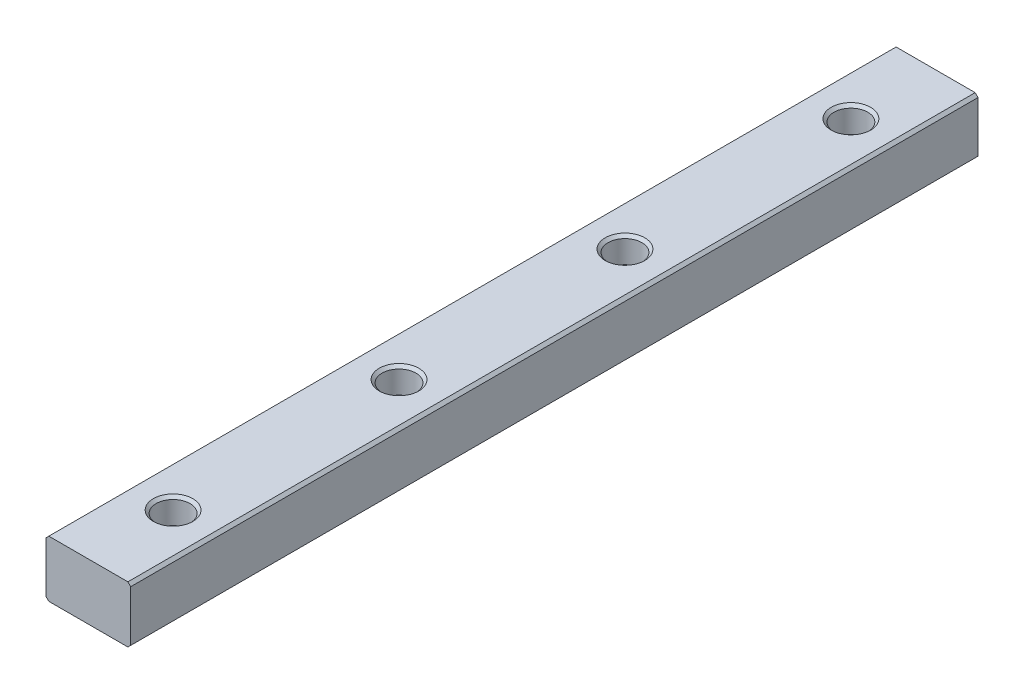
ISO-10303-21;
HEADER;
FILE_DESCRIPTION(('STEP AP214'),'2;1');
FILE_NAME('part.step','',(''),(''),'','','');
FILE_SCHEMA(('AUTOMOTIVE_DESIGN { 1 0 10303 214 1 1 1 1 }'));
ENDSEC;
DATA;
#1=APPLICATION_CONTEXT('core data for automotive mechanical design processes');
#2=APPLICATION_PROTOCOL_DEFINITION('international standard','automotive_design',2000,#1);
#3=PRODUCT_CONTEXT('',#1,'mechanical');
#4=PRODUCT('Part','Part','',(#3));
#5=PRODUCT_RELATED_PRODUCT_CATEGORY('part','',(#4));
#6=PRODUCT_DEFINITION_FORMATION('','',#4);
#7=PRODUCT_DEFINITION_CONTEXT('part definition',#1,'design');
#8=PRODUCT_DEFINITION('design','',#6,#7);
#9=PRODUCT_DEFINITION_SHAPE('','',#8);
#10=(LENGTH_UNIT() NAMED_UNIT(*) SI_UNIT(.MILLI.,.METRE.));
#11=(NAMED_UNIT(*) PLANE_ANGLE_UNIT() SI_UNIT($,.RADIAN.));
#12=(NAMED_UNIT(*) SI_UNIT($,.STERADIAN.) SOLID_ANGLE_UNIT());
#13=UNCERTAINTY_MEASURE_WITH_UNIT(LENGTH_MEASURE(1.E-05),#10,'distance_accuracy_value','');
#14=(GEOMETRIC_REPRESENTATION_CONTEXT(3) GLOBAL_UNCERTAINTY_ASSIGNED_CONTEXT((#13)) GLOBAL_UNIT_ASSIGNED_CONTEXT((#10,
#11,#12)) REPRESENTATION_CONTEXT('',''));
#15=CARTESIAN_POINT('',(0.,0.,0.));
#16=DIRECTION('',(0.,0.,1.));
#17=DIRECTION('',(1.,0.,0.));
#18=AXIS2_PLACEMENT_3D('',#15,#16,#17);
#19=CARTESIAN_POINT('',(7.5,-5.,75.));
#20=DIRECTION('',(0.,1.,0.));
#21=DIRECTION('',(0.,0.,1.));
#22=AXIS2_PLACEMENT_3D('',#19,#20,#21);
#23=PLANE('',#22);
#24=DIRECTION('',(1.,0.,0.));
#25=VECTOR('',#24,1.);
#26=CARTESIAN_POINT('',(7.5,-5.,75.));
#27=LINE('',#26,#25);
#28=CARTESIAN_POINT('',(-7.00000000000002,-5.,75.));
#29=VERTEX_POINT('',#28);
#30=CARTESIAN_POINT('',(7.,-5.,75.));
#31=VERTEX_POINT('',#30);
#32=EDGE_CURVE('E121',#29,#31,#27,.T.);
#33=ORIENTED_EDGE('',*,*,#32,.F.);
#34=DIRECTION('',(0.,0.,-1.));
#35=VECTOR('',#34,1.);
#36=CARTESIAN_POINT('',(-7.00000000000002,-5.,75.));
#37=LINE('',#36,#35);
#38=CARTESIAN_POINT('',(-7.00000000000002,-5.,-75.));
#39=VERTEX_POINT('',#38);
#40=EDGE_CURVE('E105',#29,#39,#37,.T.);
#41=ORIENTED_EDGE('',*,*,#40,.T.);
#42=DIRECTION('',(1.,0.,0.));
#43=VECTOR('',#42,1.);
#44=CARTESIAN_POINT('',(7.5,-5.,-75.));
#45=LINE('',#44,#43);
#46=CARTESIAN_POINT('',(6.99999999999999,-5.,-75.));
#47=VERTEX_POINT('',#46);
#48=EDGE_CURVE('E118',#39,#47,#45,.T.);
#49=ORIENTED_EDGE('',*,*,#48,.T.);
#50=DIRECTION('',(0.,0.,1.));
#51=VECTOR('',#50,1.);
#52=CARTESIAN_POINT('',(6.99999999999999,-5.,75.));
#53=LINE('',#52,#51);
#54=EDGE_CURVE('E123',#47,#31,#53,.T.);
#55=ORIENTED_EDGE('',*,*,#54,.T.);
#56=EDGE_LOOP('',(#33,#41,#49,#55));
#57=FACE_BOUND('',#56,.T.);
#58=CARTESIAN_POINT('',(0.,-5.,60.0000000000001));
#59=DIRECTION('',(0.,1.,0.));
#60=DIRECTION('',(0.,0.,1.));
#61=AXIS2_PLACEMENT_3D('',#58,#59,#60);
#62=CIRCLE('',#61,2.25);
#63=CARTESIAN_POINT('',(0.,-5.,62.2500000000001));
#64=VERTEX_POINT('',#63);
#65=EDGE_CURVE('E139',#64,#64,#62,.T.);
#66=ORIENTED_EDGE('',*,*,#65,.T.);
#67=EDGE_LOOP('',(#66));
#68=FACE_BOUND('',#67,.T.);
#69=CARTESIAN_POINT('',(0.,-5.,20.0000000000001));
#70=DIRECTION('',(0.,1.,0.));
#71=DIRECTION('',(0.,0.,1.));
#72=AXIS2_PLACEMENT_3D('',#69,#70,#71);
#73=CIRCLE('',#72,2.25);
#74=CARTESIAN_POINT('',(0.,-5.,22.2500000000001));
#75=VERTEX_POINT('',#74);
#76=EDGE_CURVE('E247',#75,#75,#73,.T.);
#77=ORIENTED_EDGE('',*,*,#76,.T.);
#78=EDGE_LOOP('',(#77));
#79=FACE_BOUND('',#78,.T.);
#80=CARTESIAN_POINT('',(0.,-5.,-19.9999999999999));
#81=DIRECTION('',(0.,1.,0.));
#82=DIRECTION('',(0.,0.,1.));
#83=AXIS2_PLACEMENT_3D('',#80,#81,#82);
#84=CIRCLE('',#83,2.25);
#85=CARTESIAN_POINT('',(0.,-5.,-17.7499999999999));
#86=VERTEX_POINT('',#85);
#87=EDGE_CURVE('E152',#86,#86,#84,.T.);
#88=ORIENTED_EDGE('',*,*,#87,.T.);
#89=EDGE_LOOP('',(#88));
#90=FACE_BOUND('',#89,.T.);
#91=CARTESIAN_POINT('',(0.,-5.,-59.9999999999999));
#92=DIRECTION('',(0.,1.,0.));
#93=DIRECTION('',(0.,0.,1.));
#94=AXIS2_PLACEMENT_3D('',#91,#92,#93);
#95=CIRCLE('',#94,2.25);
#96=CARTESIAN_POINT('',(0.,-5.,-57.7499999999999));
#97=VERTEX_POINT('',#96);
#98=EDGE_CURVE('E170',#97,#97,#95,.T.);
#99=ORIENTED_EDGE('',*,*,#98,.T.);
#100=EDGE_LOOP('',(#99));
#101=FACE_BOUND('',#100,.T.);
#102=ADVANCED_FACE('F35',(#57,#68,#79,#90,#101),#23,.F.);
#103=CARTESIAN_POINT('',(7.5,5.00000000000001,75.));
#104=DIRECTION('',(0.,-1.,0.));
#105=DIRECTION('',(1.,0.,0.));
#106=AXIS2_PLACEMENT_3D('',#103,#104,#105);
#107=PLANE('',#106);
#108=DIRECTION('',(-1.,0.,0.));
#109=VECTOR('',#108,1.);
#110=CARTESIAN_POINT('',(7.5,5.00000000000001,75.));
#111=LINE('',#110,#109);
#112=CARTESIAN_POINT('',(6.99999999999998,5.00000000000001,75.));
#113=VERTEX_POINT('',#112);
#114=CARTESIAN_POINT('',(-7.,5.00000000000001,75.));
#115=VERTEX_POINT('',#114);
#116=EDGE_CURVE('E143',#113,#115,#111,.T.);
#117=ORIENTED_EDGE('',*,*,#116,.F.);
#118=DIRECTION('',(0.,0.,-1.));
#119=VECTOR('',#118,1.);
#120=CARTESIAN_POINT('',(6.99999999999998,5.00000000000001,75.));
#121=LINE('',#120,#119);
#122=CARTESIAN_POINT('',(6.99999999999998,5.00000000000001,-75.));
#123=VERTEX_POINT('',#122);
#124=EDGE_CURVE('E11',#113,#123,#121,.T.);
#125=ORIENTED_EDGE('',*,*,#124,.T.);
#126=DIRECTION('',(-1.,0.,0.));
#127=VECTOR('',#126,1.);
#128=CARTESIAN_POINT('',(7.5,5.00000000000001,-75.));
#129=LINE('',#128,#127);
#130=CARTESIAN_POINT('',(-7.,5.,-75.));
#131=VERTEX_POINT('',#130);
#132=EDGE_CURVE('E131',#123,#131,#129,.T.);
#133=ORIENTED_EDGE('',*,*,#132,.T.);
#134=DIRECTION('',(0.,0.,1.));
#135=VECTOR('',#134,1.);
#136=CARTESIAN_POINT('',(-7.,5.,75.));
#137=LINE('',#136,#135);
#138=EDGE_CURVE('E43',#131,#115,#137,.T.);
#139=ORIENTED_EDGE('',*,*,#138,.T.);
#140=EDGE_LOOP('',(#117,#125,#133,#139));
#141=FACE_BOUND('',#140,.T.);
#142=CARTESIAN_POINT('',(0.,5.00000000000001,60.0000000000001));
#143=DIRECTION('',(0.,-1.,0.));
#144=DIRECTION('',(1.,0.,0.));
#145=AXIS2_PLACEMENT_3D('',#142,#143,#144);
#146=CIRCLE('',#145,3.50000000000002);
#147=CARTESIAN_POINT('',(3.50000000000002,5.00000000000001,60.0000000000001));
#148=VERTEX_POINT('',#147);
#149=EDGE_CURVE('E149',#148,#148,#146,.T.);
#150=ORIENTED_EDGE('',*,*,#149,.T.);
#151=EDGE_LOOP('',(#150));
#152=FACE_BOUND('',#151,.T.);
#153=CARTESIAN_POINT('',(0.,5.00000000000001,20.0000000000001));
#154=DIRECTION('',(0.,-1.,0.));
#155=DIRECTION('',(1.,0.,0.));
#156=AXIS2_PLACEMENT_3D('',#153,#154,#155);
#157=CIRCLE('',#156,3.50000000000002);
#158=CARTESIAN_POINT('',(3.50000000000002,5.00000000000001,20.0000000000001));
#159=VERTEX_POINT('',#158);
#160=EDGE_CURVE('E244',#159,#159,#157,.T.);
#161=ORIENTED_EDGE('',*,*,#160,.T.);
#162=EDGE_LOOP('',(#161));
#163=FACE_BOUND('',#162,.T.);
#164=CARTESIAN_POINT('',(0.,5.00000000000001,-19.9999999999999));
#165=DIRECTION('',(0.,-1.,0.));
#166=DIRECTION('',(1.,0.,0.));
#167=AXIS2_PLACEMENT_3D('',#164,#165,#166);
#168=CIRCLE('',#167,3.50000000000002);
#169=CARTESIAN_POINT('',(3.50000000000002,5.00000000000001,-19.9999999999999));
#170=VERTEX_POINT('',#169);
#171=EDGE_CURVE('E155',#170,#170,#168,.T.);
#172=ORIENTED_EDGE('',*,*,#171,.T.);
#173=EDGE_LOOP('',(#172));
#174=FACE_BOUND('',#173,.T.);
#175=CARTESIAN_POINT('',(0.,5.00000000000001,-59.9999999999999));
#176=DIRECTION('',(0.,-1.,0.));
#177=DIRECTION('',(1.,0.,0.));
#178=AXIS2_PLACEMENT_3D('',#175,#176,#177);
#179=CIRCLE('',#178,3.50000000000002);
#180=CARTESIAN_POINT('',(3.50000000000002,5.00000000000001,-59.9999999999999));
#181=VERTEX_POINT('',#180);
#182=EDGE_CURVE('E173',#181,#181,#179,.T.);
#183=ORIENTED_EDGE('',*,*,#182,.T.);
#184=EDGE_LOOP('',(#183));
#185=FACE_BOUND('',#184,.T.);
#186=ADVANCED_FACE('F219',(#141,#152,#163,#174,#185),#107,.F.);
#187=CARTESIAN_POINT('',(-7.5,-5.,75.));
#188=DIRECTION('',(1.,0.,0.));
#189=DIRECTION('',(0.,0.,-1.));
#190=AXIS2_PLACEMENT_3D('',#187,#188,#189);
#191=PLANE('',#190);
#192=DIRECTION('',(0.,-1.,0.));
#193=VECTOR('',#192,1.);
#194=CARTESIAN_POINT('',(-7.5,-5.,-75.));
#195=LINE('',#194,#193);
#196=CARTESIAN_POINT('',(-7.50000000000001,4.50000000000002,-75.));
#197=VERTEX_POINT('',#196);
#198=CARTESIAN_POINT('',(-7.5,-4.5,-75.));
#199=VERTEX_POINT('',#198);
#200=EDGE_CURVE('E128',#197,#199,#195,.T.);
#201=ORIENTED_EDGE('',*,*,#200,.T.);
#202=DIRECTION('',(0.,0.,1.));
#203=VECTOR('',#202,1.);
#204=CARTESIAN_POINT('',(-7.5,-4.5,75.));
#205=LINE('',#204,#203);
#206=CARTESIAN_POINT('',(-7.5,-4.5,75.));
#207=VERTEX_POINT('',#206);
#208=EDGE_CURVE('E106',#199,#207,#205,.T.);
#209=ORIENTED_EDGE('',*,*,#208,.T.);
#210=DIRECTION('',(0.,-1.,0.));
#211=VECTOR('',#210,1.);
#212=CARTESIAN_POINT('',(-7.5,-5.,75.));
#213=LINE('',#212,#211);
#214=CARTESIAN_POINT('',(-7.50000000000001,4.50000000000002,75.));
#215=VERTEX_POINT('',#214);
#216=EDGE_CURVE('E138',#215,#207,#213,.T.);
#217=ORIENTED_EDGE('',*,*,#216,.F.);
#218=DIRECTION('',(0.,0.,-1.));
#219=VECTOR('',#218,1.);
#220=CARTESIAN_POINT('',(-7.5,4.50000000000002,75.));
#221=LINE('',#220,#219);
#222=EDGE_CURVE('E111',#215,#197,#221,.T.);
#223=ORIENTED_EDGE('',*,*,#222,.T.);
#224=EDGE_LOOP('',(#201,#209,#217,#223));
#225=FACE_BOUND('',#224,.T.);
#226=ADVANCED_FACE('F275',(#225),#191,.F.);
#227=CARTESIAN_POINT('',(7.5,-5.,75.));
#228=DIRECTION('',(-1.,0.,0.));
#229=DIRECTION('',(0.,0.,1.));
#230=AXIS2_PLACEMENT_3D('',#227,#228,#229);
#231=PLANE('',#230);
#232=DIRECTION('',(0.,1.,0.));
#233=VECTOR('',#232,1.);
#234=CARTESIAN_POINT('',(7.5,-5.,75.));
#235=LINE('',#234,#233);
#236=CARTESIAN_POINT('',(7.5,-4.50000000000001,75.));
#237=VERTEX_POINT('',#236);
#238=CARTESIAN_POINT('',(7.5,4.49999999999999,75.));
#239=VERTEX_POINT('',#238);
#240=EDGE_CURVE('E212',#237,#239,#235,.T.);
#241=ORIENTED_EDGE('',*,*,#240,.F.);
#242=DIRECTION('',(0.,0.,-1.));
#243=VECTOR('',#242,1.);
#244=CARTESIAN_POINT('',(7.5,-4.50000000000001,75.));
#245=LINE('',#244,#243);
#246=CARTESIAN_POINT('',(7.5,-4.50000000000001,-75.));
#247=VERTEX_POINT('',#246);
#248=EDGE_CURVE('E205',#237,#247,#245,.T.);
#249=ORIENTED_EDGE('',*,*,#248,.T.);
#250=DIRECTION('',(0.,1.,0.));
#251=VECTOR('',#250,1.);
#252=CARTESIAN_POINT('',(7.5,-5.,-75.));
#253=LINE('',#252,#251);
#254=CARTESIAN_POINT('',(7.5,4.49999999999999,-75.));
#255=VERTEX_POINT('',#254);
#256=EDGE_CURVE('E127',#247,#255,#253,.T.);
#257=ORIENTED_EDGE('',*,*,#256,.T.);
#258=DIRECTION('',(0.,0.,1.));
#259=VECTOR('',#258,1.);
#260=CARTESIAN_POINT('',(7.5,4.49999999999999,75.));
#261=LINE('',#260,#259);
#262=EDGE_CURVE('E203',#255,#239,#261,.T.);
#263=ORIENTED_EDGE('',*,*,#262,.T.);
#264=EDGE_LOOP('',(#241,#249,#257,#263));
#265=FACE_BOUND('',#264,.T.);
#266=ADVANCED_FACE('F210',(#265),#231,.F.);
#267=CARTESIAN_POINT('',(0.,0.,75.));
#268=DIRECTION('',(0.,0.,1.));
#269=DIRECTION('',(1.,0.,0.));
#270=AXIS2_PLACEMENT_3D('',#267,#268,#269);
#271=PLANE('',#270);
#272=ORIENTED_EDGE('',*,*,#216,.T.);
#273=DIRECTION('',(-0.707106781186538,0.707106781186557,0.));
#274=VECTOR('',#273,1.);
#275=CARTESIAN_POINT('',(-6.0000000000001,-5.99999999999994,75.));
#276=LINE('',#275,#274);
#277=EDGE_CURVE('E201',#207,#29,#276,.F.);
#278=ORIENTED_EDGE('',*,*,#277,.T.);
#279=ORIENTED_EDGE('',*,*,#32,.T.);
#280=DIRECTION('',(-0.707106781186557,-0.707106781186538,0.));
#281=VECTOR('',#280,1.);
#282=CARTESIAN_POINT('',(5.9999999999999,-6.00000000000007,75.));
#283=LINE('',#282,#281);
#284=EDGE_CURVE('E199',#31,#237,#283,.F.);
#285=ORIENTED_EDGE('',*,*,#284,.T.);
#286=ORIENTED_EDGE('',*,*,#240,.T.);
#287=DIRECTION('',(0.707106781186548,-0.707106781186548,0.));
#288=VECTOR('',#287,1.);
#289=CARTESIAN_POINT('',(5.99999999999999,5.99999999999999,75.));
#290=LINE('',#289,#288);
#291=EDGE_CURVE('E56',#239,#113,#290,.F.);
#292=ORIENTED_EDGE('',*,*,#291,.T.);
#293=ORIENTED_EDGE('',*,*,#116,.T.);
#294=DIRECTION('',(0.707106781186557,0.707106781186538,0.));
#295=VECTOR('',#294,1.);
#296=CARTESIAN_POINT('',(-5.99999999999991,6.00000000000007,75.));
#297=LINE('',#296,#295);
#298=EDGE_CURVE('E196',#115,#215,#297,.F.);
#299=ORIENTED_EDGE('',*,*,#298,.T.);
#300=EDGE_LOOP('',(#272,#278,#279,#285,#286,#292,#293,#299));
#301=FACE_BOUND('',#300,.T.);
#302=ADVANCED_FACE('F344',(#301),#271,.T.);
#303=CARTESIAN_POINT('',(0.,0.,-75.));
#304=DIRECTION('',(0.,0.,1.));
#305=DIRECTION('',(1.,0.,0.));
#306=AXIS2_PLACEMENT_3D('',#303,#304,#305);
#307=PLANE('',#306);
#308=ORIENTED_EDGE('',*,*,#48,.F.);
#309=DIRECTION('',(0.707106781186538,-0.707106781186557,0.));
#310=VECTOR('',#309,1.);
#311=CARTESIAN_POINT('',(-7.00000000000002,-5.,-75.));
#312=LINE('',#311,#310);
#313=EDGE_CURVE('E101',#39,#199,#312,.F.);
#314=ORIENTED_EDGE('',*,*,#313,.T.);
#315=ORIENTED_EDGE('',*,*,#200,.F.);
#316=DIRECTION('',(-0.707106781186557,-0.707106781186538,0.));
#317=VECTOR('',#316,1.);
#318=CARTESIAN_POINT('',(-7.5,4.50000000000002,-75.));
#319=LINE('',#318,#317);
#320=EDGE_CURVE('E122',#197,#131,#319,.F.);
#321=ORIENTED_EDGE('',*,*,#320,.T.);
#322=ORIENTED_EDGE('',*,*,#132,.F.);
#323=DIRECTION('',(-0.707106781186548,0.707106781186548,0.));
#324=VECTOR('',#323,1.);
#325=CARTESIAN_POINT('',(6.99999999999998,5.00000000000001,-75.));
#326=LINE('',#325,#324);
#327=EDGE_CURVE('E190',#123,#255,#326,.F.);
#328=ORIENTED_EDGE('',*,*,#327,.T.);
#329=ORIENTED_EDGE('',*,*,#256,.F.);
#330=DIRECTION('',(0.707106781186557,0.707106781186538,0.));
#331=VECTOR('',#330,1.);
#332=CARTESIAN_POINT('',(7.5,-4.50000000000001,-75.));
#333=LINE('',#332,#331);
#334=EDGE_CURVE('E112',#247,#47,#333,.F.);
#335=ORIENTED_EDGE('',*,*,#334,.T.);
#336=EDGE_LOOP('',(#308,#314,#315,#321,#322,#328,#329,#335));
#337=FACE_BOUND('',#336,.T.);
#338=ADVANCED_FACE('F125',(#337),#307,.F.);
#339=CARTESIAN_POINT('',(0.,0.500000000000007,60.0000000000001));
#340=DIRECTION('',(0.,1.,0.));
#341=DIRECTION('',(-1.,0.,0.));
#342=AXIS2_PLACEMENT_3D('',#339,#340,#341);
#343=CYLINDRICAL_SURFACE('',#342,3.);
#344=CARTESIAN_POINT('',(0.,4.50000000000001,60.0000000000001));
#345=DIRECTION('',(0.,-1.,0.));
#346=DIRECTION('',(1.,0.,0.));
#347=AXIS2_PLACEMENT_3D('',#344,#345,#346);
#348=CIRCLE('',#347,3.);
#349=CARTESIAN_POINT('',(3.,4.50000000000001,60.0000000000001));
#350=VERTEX_POINT('',#349);
#351=EDGE_CURVE('E146',#350,#350,#348,.F.);
#352=ORIENTED_EDGE('',*,*,#351,.T.);
#353=EDGE_LOOP('',(#352));
#354=FACE_BOUND('',#353,.T.);
#355=CARTESIAN_POINT('',(0.,0.500000000000007,60.0000000000001));
#356=DIRECTION('',(0.,1.,0.));
#357=DIRECTION('',(-1.,0.,0.));
#358=AXIS2_PLACEMENT_3D('',#355,#356,#357);
#359=CIRCLE('',#358,3.);
#360=CARTESIAN_POINT('',(-3.,0.500000000000006,60.0000000000001));
#361=VERTEX_POINT('',#360);
#362=EDGE_CURVE('E133',#361,#361,#359,.T.);
#363=ORIENTED_EDGE('',*,*,#362,.F.);
#364=EDGE_LOOP('',(#363));
#365=FACE_BOUND('',#364,.T.);
#366=ADVANCED_FACE('F351',(#354,#365),#343,.F.);
#367=CARTESIAN_POINT('',(0.,0.500000000000007,60.0000000000001));
#368=DIRECTION('',(0.,1.,0.));
#369=DIRECTION('',(-1.,0.,0.));
#370=AXIS2_PLACEMENT_3D('',#367,#368,#369);
#371=PLANE('',#370);
#372=CARTESIAN_POINT('',(0.,0.500000000000007,60.0000000000001));
#373=DIRECTION('',(0.,1.,0.));
#374=DIRECTION('',(-1.,0.,0.));
#375=AXIS2_PLACEMENT_3D('',#372,#373,#374);
#376=CIRCLE('',#375,1.75);
#377=CARTESIAN_POINT('',(-1.75,0.500000000000006,60.0000000000001));
#378=VERTEX_POINT('',#377);
#379=EDGE_CURVE('E229',#378,#378,#376,.T.);
#380=ORIENTED_EDGE('',*,*,#379,.F.);
#381=EDGE_LOOP('',(#380));
#382=FACE_BOUND('',#381,.T.);
#383=ORIENTED_EDGE('',*,*,#362,.T.);
#384=EDGE_LOOP('',(#383));
#385=FACE_BOUND('',#384,.T.);
#386=ADVANCED_FACE('F356',(#382,#385),#371,.T.);
#387=CARTESIAN_POINT('',(0.,-5.,60.0000000000001));
#388=DIRECTION('',(0.,1.,0.));
#389=DIRECTION('',(-1.,0.,0.));
#390=AXIS2_PLACEMENT_3D('',#387,#388,#389);
#391=CYLINDRICAL_SURFACE('',#390,1.75);
#392=CARTESIAN_POINT('',(0.,-4.49999999999999,60.0000000000001));
#393=DIRECTION('',(0.,1.,0.));
#394=DIRECTION('',(-1.,0.,0.));
#395=AXIS2_PLACEMENT_3D('',#392,#393,#394);
#396=CIRCLE('',#395,1.75);
#397=CARTESIAN_POINT('',(-1.75,-4.49999999999999,60.0000000000001));
#398=VERTEX_POINT('',#397);
#399=EDGE_CURVE('E142',#398,#398,#396,.F.);
#400=ORIENTED_EDGE('',*,*,#399,.T.);
#401=EDGE_LOOP('',(#400));
#402=FACE_BOUND('',#401,.T.);
#403=ORIENTED_EDGE('',*,*,#379,.T.);
#404=EDGE_LOOP('',(#403));
#405=FACE_BOUND('',#404,.T.);
#406=ADVANCED_FACE('F286',(#402,#405),#391,.F.);
#407=CARTESIAN_POINT('',(0.,-5.,60.0000000000001));
#408=DIRECTION('',(0.,-1.,0.));
#409=DIRECTION('',(1.,0.,0.));
#410=AXIS2_PLACEMENT_3D('',#407,#408,#409);
#411=CONICAL_SURFACE('',#410,2.25,0.785398163397442);
#412=ORIENTED_EDGE('',*,*,#399,.F.);
#413=EDGE_LOOP('',(#412));
#414=FACE_BOUND('',#413,.T.);
#415=ORIENTED_EDGE('',*,*,#65,.F.);
#416=EDGE_LOOP('',(#415));
#417=FACE_BOUND('',#416,.T.);
#418=ADVANCED_FACE('F282',(#414,#417),#411,.F.);
#419=CARTESIAN_POINT('',(0.,4.50000000000001,60.0000000000001));
#420=DIRECTION('',(0.,1.,0.));
#421=DIRECTION('',(-1.,0.,0.));
#422=AXIS2_PLACEMENT_3D('',#419,#420,#421);
#423=CONICAL_SURFACE('',#422,3.,0.785398163397466);
#424=ORIENTED_EDGE('',*,*,#149,.F.);
#425=EDGE_LOOP('',(#424));
#426=FACE_BOUND('',#425,.T.);
#427=ORIENTED_EDGE('',*,*,#351,.F.);
#428=EDGE_LOOP('',(#427));
#429=FACE_BOUND('',#428,.T.);
#430=ADVANCED_FACE('F285',(#426,#429),#423,.F.);
#431=CARTESIAN_POINT('',(0.,4.50000000000001,20.0000000000001));
#432=DIRECTION('',(0.,1.,0.));
#433=DIRECTION('',(-1.,0.,0.));
#434=AXIS2_PLACEMENT_3D('',#431,#432,#433);
#435=CONICAL_SURFACE('',#434,3.,0.785398163397466);
#436=ORIENTED_EDGE('',*,*,#160,.F.);
#437=EDGE_LOOP('',(#436));
#438=FACE_BOUND('',#437,.T.);
#439=CARTESIAN_POINT('',(0.,4.50000000000001,20.0000000000001));
#440=DIRECTION('',(0.,-1.,0.));
#441=DIRECTION('',(1.,0.,0.));
#442=AXIS2_PLACEMENT_3D('',#439,#440,#441);
#443=CIRCLE('',#442,3.);
#444=CARTESIAN_POINT('',(3.,4.50000000000001,20.0000000000001));
#445=VERTEX_POINT('',#444);
#446=EDGE_CURVE('E232',#445,#445,#443,.F.);
#447=ORIENTED_EDGE('',*,*,#446,.F.);
#448=EDGE_LOOP('',(#447));
#449=FACE_BOUND('',#448,.T.);
#450=ADVANCED_FACE('F290',(#438,#449),#435,.F.);
#451=CARTESIAN_POINT('',(0.,0.500000000000007,20.0000000000001));
#452=DIRECTION('',(0.,1.,0.));
#453=DIRECTION('',(-1.,0.,0.));
#454=AXIS2_PLACEMENT_3D('',#451,#452,#453);
#455=CYLINDRICAL_SURFACE('',#454,3.);
#456=ORIENTED_EDGE('',*,*,#446,.T.);
#457=EDGE_LOOP('',(#456));
#458=FACE_BOUND('',#457,.T.);
#459=CARTESIAN_POINT('',(0.,0.500000000000007,20.0000000000001));
#460=DIRECTION('',(0.,1.,0.));
#461=DIRECTION('',(-1.,0.,0.));
#462=AXIS2_PLACEMENT_3D('',#459,#460,#461);
#463=CIRCLE('',#462,3.);
#464=CARTESIAN_POINT('',(-3.,0.500000000000006,20.0000000000001));
#465=VERTEX_POINT('',#464);
#466=EDGE_CURVE('E235',#465,#465,#463,.T.);
#467=ORIENTED_EDGE('',*,*,#466,.F.);
#468=EDGE_LOOP('',(#467));
#469=FACE_BOUND('',#468,.T.);
#470=ADVANCED_FACE('F266',(#458,#469),#455,.F.);
#471=CARTESIAN_POINT('',(0.,0.500000000000007,20.0000000000001));
#472=DIRECTION('',(0.,1.,0.));
#473=DIRECTION('',(-1.,0.,0.));
#474=AXIS2_PLACEMENT_3D('',#471,#472,#473);
#475=PLANE('',#474);
#476=CARTESIAN_POINT('',(0.,0.500000000000007,20.0000000000001));
#477=DIRECTION('',(0.,1.,0.));
#478=DIRECTION('',(-1.,0.,0.));
#479=AXIS2_PLACEMENT_3D('',#476,#477,#478);
#480=CIRCLE('',#479,1.75);
#481=CARTESIAN_POINT('',(-1.75,0.500000000000006,20.0000000000001));
#482=VERTEX_POINT('',#481);
#483=EDGE_CURVE('E238',#482,#482,#480,.T.);
#484=ORIENTED_EDGE('',*,*,#483,.F.);
#485=EDGE_LOOP('',(#484));
#486=FACE_BOUND('',#485,.T.);
#487=ORIENTED_EDGE('',*,*,#466,.T.);
#488=EDGE_LOOP('',(#487));
#489=FACE_BOUND('',#488,.T.);
#490=ADVANCED_FACE('F256',(#486,#489),#475,.T.);
#491=CARTESIAN_POINT('',(0.,-5.,20.0000000000001));
#492=DIRECTION('',(0.,-1.,0.));
#493=DIRECTION('',(1.,0.,0.));
#494=AXIS2_PLACEMENT_3D('',#491,#492,#493);
#495=CONICAL_SURFACE('',#494,2.25,0.785398163397442);
#496=CARTESIAN_POINT('',(0.,-4.49999999999999,20.0000000000001));
#497=DIRECTION('',(0.,1.,0.));
#498=DIRECTION('',(-1.,0.,0.));
#499=AXIS2_PLACEMENT_3D('',#496,#497,#498);
#500=CIRCLE('',#499,1.75);
#501=CARTESIAN_POINT('',(-1.75,-4.49999999999999,20.0000000000001));
#502=VERTEX_POINT('',#501);
#503=EDGE_CURVE('E241',#502,#502,#500,.F.);
#504=ORIENTED_EDGE('',*,*,#503,.F.);
#505=EDGE_LOOP('',(#504));
#506=FACE_BOUND('',#505,.T.);
#507=ORIENTED_EDGE('',*,*,#76,.F.);
#508=EDGE_LOOP('',(#507));
#509=FACE_BOUND('',#508,.T.);
#510=ADVANCED_FACE('F253',(#506,#509),#495,.F.);
#511=CARTESIAN_POINT('',(0.,-5.,20.0000000000001));
#512=DIRECTION('',(0.,1.,0.));
#513=DIRECTION('',(-1.,0.,0.));
#514=AXIS2_PLACEMENT_3D('',#511,#512,#513);
#515=CYLINDRICAL_SURFACE('',#514,1.75);
#516=ORIENTED_EDGE('',*,*,#503,.T.);
#517=EDGE_LOOP('',(#516));
#518=FACE_BOUND('',#517,.T.);
#519=ORIENTED_EDGE('',*,*,#483,.T.);
#520=EDGE_LOOP('',(#519));
#521=FACE_BOUND('',#520,.T.);
#522=ADVANCED_FACE('F255',(#518,#521),#515,.F.);
#523=CARTESIAN_POINT('',(0.,-5.,-19.9999999999999));
#524=DIRECTION('',(0.,1.,0.));
#525=DIRECTION('',(-1.,0.,0.));
#526=AXIS2_PLACEMENT_3D('',#523,#524,#525);
#527=CYLINDRICAL_SURFACE('',#526,1.75);
#528=CARTESIAN_POINT('',(0.,-4.49999999999999,-19.9999999999999));
#529=DIRECTION('',(0.,1.,0.));
#530=DIRECTION('',(-1.,0.,0.));
#531=AXIS2_PLACEMENT_3D('',#528,#529,#530);
#532=CIRCLE('',#531,1.75);
#533=CARTESIAN_POINT('',(-1.75,-4.49999999999999,-19.9999999999999));
#534=VERTEX_POINT('',#533);
#535=EDGE_CURVE('E167',#534,#534,#532,.F.);
#536=ORIENTED_EDGE('',*,*,#535,.T.);
#537=EDGE_LOOP('',(#536));
#538=FACE_BOUND('',#537,.T.);
#539=CARTESIAN_POINT('',(0.,0.500000000000007,-19.9999999999999));
#540=DIRECTION('',(0.,1.,0.));
#541=DIRECTION('',(-1.,0.,0.));
#542=AXIS2_PLACEMENT_3D('',#539,#540,#541);
#543=CIRCLE('',#542,1.75);
#544=CARTESIAN_POINT('',(-1.75,0.500000000000006,-19.9999999999999));
#545=VERTEX_POINT('',#544);
#546=EDGE_CURVE('E164',#545,#545,#543,.T.);
#547=ORIENTED_EDGE('',*,*,#546,.T.);
#548=EDGE_LOOP('',(#547));
#549=FACE_BOUND('',#548,.T.);
#550=ADVANCED_FACE('F263',(#538,#549),#527,.F.);
#551=CARTESIAN_POINT('',(0.,-5.,-19.9999999999999));
#552=DIRECTION('',(0.,-1.,0.));
#553=DIRECTION('',(1.,0.,0.));
#554=AXIS2_PLACEMENT_3D('',#551,#552,#553);
#555=CONICAL_SURFACE('',#554,2.25,0.785398163397442);
#556=ORIENTED_EDGE('',*,*,#535,.F.);
#557=EDGE_LOOP('',(#556));
#558=FACE_BOUND('',#557,.T.);
#559=ORIENTED_EDGE('',*,*,#87,.F.);
#560=EDGE_LOOP('',(#559));
#561=FACE_BOUND('',#560,.T.);
#562=ADVANCED_FACE('F304',(#558,#561),#555,.F.);
#563=CARTESIAN_POINT('',(0.,0.500000000000007,-19.9999999999999));
#564=DIRECTION('',(0.,1.,0.));
#565=DIRECTION('',(-1.,0.,0.));
#566=AXIS2_PLACEMENT_3D('',#563,#564,#565);
#567=PLANE('',#566);
#568=ORIENTED_EDGE('',*,*,#546,.F.);
#569=EDGE_LOOP('',(#568));
#570=FACE_BOUND('',#569,.T.);
#571=CARTESIAN_POINT('',(0.,0.500000000000007,-19.9999999999999));
#572=DIRECTION('',(0.,1.,0.));
#573=DIRECTION('',(-1.,0.,0.));
#574=AXIS2_PLACEMENT_3D('',#571,#572,#573);
#575=CIRCLE('',#574,3.);
#576=CARTESIAN_POINT('',(-3.,0.500000000000006,-19.9999999999999));
#577=VERTEX_POINT('',#576);
#578=EDGE_CURVE('E161',#577,#577,#575,.T.);
#579=ORIENTED_EDGE('',*,*,#578,.T.);
#580=EDGE_LOOP('',(#579));
#581=FACE_BOUND('',#580,.T.);
#582=ADVANCED_FACE('F300',(#570,#581),#567,.T.);
#583=CARTESIAN_POINT('',(0.,0.500000000000007,-19.9999999999999));
#584=DIRECTION('',(0.,1.,0.));
#585=DIRECTION('',(-1.,0.,0.));
#586=AXIS2_PLACEMENT_3D('',#583,#584,#585);
#587=CYLINDRICAL_SURFACE('',#586,3.);
#588=CARTESIAN_POINT('',(0.,4.50000000000001,-19.9999999999999));
#589=DIRECTION('',(0.,-1.,0.));
#590=DIRECTION('',(1.,0.,0.));
#591=AXIS2_PLACEMENT_3D('',#588,#589,#590);
#592=CIRCLE('',#591,3.);
#593=CARTESIAN_POINT('',(3.,4.50000000000001,-19.9999999999999));
#594=VERTEX_POINT('',#593);
#595=EDGE_CURVE('E158',#594,#594,#592,.F.);
#596=ORIENTED_EDGE('',*,*,#595,.T.);
#597=EDGE_LOOP('',(#596));
#598=FACE_BOUND('',#597,.T.);
#599=ORIENTED_EDGE('',*,*,#578,.F.);
#600=EDGE_LOOP('',(#599));
#601=FACE_BOUND('',#600,.T.);
#602=ADVANCED_FACE('F296',(#598,#601),#587,.F.);
#603=CARTESIAN_POINT('',(0.,4.50000000000001,-19.9999999999999));
#604=DIRECTION('',(0.,1.,0.));
#605=DIRECTION('',(-1.,0.,0.));
#606=AXIS2_PLACEMENT_3D('',#603,#604,#605);
#607=CONICAL_SURFACE('',#606,3.,0.785398163397466);
#608=ORIENTED_EDGE('',*,*,#171,.F.);
#609=EDGE_LOOP('',(#608));
#610=FACE_BOUND('',#609,.T.);
#611=ORIENTED_EDGE('',*,*,#595,.F.);
#612=EDGE_LOOP('',(#611));
#613=FACE_BOUND('',#612,.T.);
#614=ADVANCED_FACE('F292',(#610,#613),#607,.F.);
#615=CARTESIAN_POINT('',(0.,-5.,-59.9999999999999));
#616=DIRECTION('',(0.,1.,0.));
#617=DIRECTION('',(-1.,0.,0.));
#618=AXIS2_PLACEMENT_3D('',#615,#616,#617);
#619=CYLINDRICAL_SURFACE('',#618,1.75);
#620=CARTESIAN_POINT('',(0.,-4.49999999999999,-59.9999999999999));
#621=DIRECTION('',(0.,1.,0.));
#622=DIRECTION('',(-1.,0.,0.));
#623=AXIS2_PLACEMENT_3D('',#620,#621,#622);
#624=CIRCLE('',#623,1.75);
#625=CARTESIAN_POINT('',(-1.75,-4.49999999999999,-59.9999999999999));
#626=VERTEX_POINT('',#625);
#627=EDGE_CURVE('E185',#626,#626,#624,.F.);
#628=ORIENTED_EDGE('',*,*,#627,.T.);
#629=EDGE_LOOP('',(#628));
#630=FACE_BOUND('',#629,.T.);
#631=CARTESIAN_POINT('',(0.,0.500000000000007,-59.9999999999999));
#632=DIRECTION('',(0.,1.,0.));
#633=DIRECTION('',(-1.,0.,0.));
#634=AXIS2_PLACEMENT_3D('',#631,#632,#633);
#635=CIRCLE('',#634,1.75);
#636=CARTESIAN_POINT('',(-1.75,0.500000000000006,-59.9999999999999));
#637=VERTEX_POINT('',#636);
#638=EDGE_CURVE('E182',#637,#637,#635,.T.);
#639=ORIENTED_EDGE('',*,*,#638,.T.);
#640=EDGE_LOOP('',(#639));
#641=FACE_BOUND('',#640,.T.);
#642=ADVANCED_FACE('F295',(#630,#641),#619,.F.);
#643=CARTESIAN_POINT('',(0.,-5.,-59.9999999999999));
#644=DIRECTION('',(0.,-1.,0.));
#645=DIRECTION('',(1.,0.,0.));
#646=AXIS2_PLACEMENT_3D('',#643,#644,#645);
#647=CONICAL_SURFACE('',#646,2.25,0.785398163397442);
#648=ORIENTED_EDGE('',*,*,#627,.F.);
#649=EDGE_LOOP('',(#648));
#650=FACE_BOUND('',#649,.T.);
#651=ORIENTED_EDGE('',*,*,#98,.F.);
#652=EDGE_LOOP('',(#651));
#653=FACE_BOUND('',#652,.T.);
#654=ADVANCED_FACE('F323',(#650,#653),#647,.F.);
#655=CARTESIAN_POINT('',(0.,0.500000000000007,-59.9999999999999));
#656=DIRECTION('',(0.,1.,0.));
#657=DIRECTION('',(-1.,0.,0.));
#658=AXIS2_PLACEMENT_3D('',#655,#656,#657);
#659=PLANE('',#658);
#660=ORIENTED_EDGE('',*,*,#638,.F.);
#661=EDGE_LOOP('',(#660));
#662=FACE_BOUND('',#661,.T.);
#663=CARTESIAN_POINT('',(0.,0.500000000000007,-59.9999999999999));
#664=DIRECTION('',(0.,1.,0.));
#665=DIRECTION('',(-1.,0.,0.));
#666=AXIS2_PLACEMENT_3D('',#663,#664,#665);
#667=CIRCLE('',#666,3.);
#668=CARTESIAN_POINT('',(-3.,0.500000000000006,-59.9999999999999));
#669=VERTEX_POINT('',#668);
#670=EDGE_CURVE('E179',#669,#669,#667,.T.);
#671=ORIENTED_EDGE('',*,*,#670,.T.);
#672=EDGE_LOOP('',(#671));
#673=FACE_BOUND('',#672,.T.);
#674=ADVANCED_FACE('F319',(#662,#673),#659,.T.);
#675=CARTESIAN_POINT('',(0.,0.500000000000007,-59.9999999999999));
#676=DIRECTION('',(0.,1.,0.));
#677=DIRECTION('',(-1.,0.,0.));
#678=AXIS2_PLACEMENT_3D('',#675,#676,#677);
#679=CYLINDRICAL_SURFACE('',#678,3.);
#680=CARTESIAN_POINT('',(0.,4.50000000000001,-59.9999999999999));
#681=DIRECTION('',(0.,-1.,0.));
#682=DIRECTION('',(1.,0.,0.));
#683=AXIS2_PLACEMENT_3D('',#680,#681,#682);
#684=CIRCLE('',#683,3.);
#685=CARTESIAN_POINT('',(3.,4.50000000000001,-59.9999999999999));
#686=VERTEX_POINT('',#685);
#687=EDGE_CURVE('E176',#686,#686,#684,.F.);
#688=ORIENTED_EDGE('',*,*,#687,.T.);
#689=EDGE_LOOP('',(#688));
#690=FACE_BOUND('',#689,.T.);
#691=ORIENTED_EDGE('',*,*,#670,.F.);
#692=EDGE_LOOP('',(#691));
#693=FACE_BOUND('',#692,.T.);
#694=ADVANCED_FACE('F315',(#690,#693),#679,.F.);
#695=CARTESIAN_POINT('',(0.,4.50000000000001,-59.9999999999999));
#696=DIRECTION('',(0.,1.,0.));
#697=DIRECTION('',(-1.,0.,0.));
#698=AXIS2_PLACEMENT_3D('',#695,#696,#697);
#699=CONICAL_SURFACE('',#698,3.,0.785398163397466);
#700=ORIENTED_EDGE('',*,*,#182,.F.);
#701=EDGE_LOOP('',(#700));
#702=FACE_BOUND('',#701,.T.);
#703=ORIENTED_EDGE('',*,*,#687,.F.);
#704=EDGE_LOOP('',(#703));
#705=FACE_BOUND('',#704,.T.);
#706=ADVANCED_FACE('F312',(#702,#705),#699,.F.);
#707=CARTESIAN_POINT('',(-7.00000000000002,-5.,75.));
#708=DIRECTION('',(0.707106781186557,0.707106781186538,0.));
#709=DIRECTION('',(0.,0.,-1.));
#710=AXIS2_PLACEMENT_3D('',#707,#708,#709);
#711=PLANE('',#710);
#712=ORIENTED_EDGE('',*,*,#277,.F.);
#713=ORIENTED_EDGE('',*,*,#208,.F.);
#714=ORIENTED_EDGE('',*,*,#313,.F.);
#715=ORIENTED_EDGE('',*,*,#40,.F.);
#716=EDGE_LOOP('',(#712,#713,#714,#715));
#717=FACE_BOUND('',#716,.T.);
#718=ADVANCED_FACE('F104',(#717),#711,.F.);
#719=CARTESIAN_POINT('',(7.5,-4.50000000000001,75.));
#720=DIRECTION('',(-0.707106781186538,0.707106781186557,0.));
#721=DIRECTION('',(0.,0.,-1.));
#722=AXIS2_PLACEMENT_3D('',#719,#720,#721);
#723=PLANE('',#722);
#724=ORIENTED_EDGE('',*,*,#284,.F.);
#725=ORIENTED_EDGE('',*,*,#54,.F.);
#726=ORIENTED_EDGE('',*,*,#334,.F.);
#727=ORIENTED_EDGE('',*,*,#248,.F.);
#728=EDGE_LOOP('',(#724,#725,#726,#727));
#729=FACE_BOUND('',#728,.T.);
#730=ADVANCED_FACE('F333',(#729),#723,.F.);
#731=CARTESIAN_POINT('',(6.99999999999998,5.00000000000001,75.));
#732=DIRECTION('',(-0.707106781186548,-0.707106781186548,0.));
#733=DIRECTION('',(0.,0.,-1.));
#734=AXIS2_PLACEMENT_3D('',#731,#732,#733);
#735=PLANE('',#734);
#736=ORIENTED_EDGE('',*,*,#291,.F.);
#737=ORIENTED_EDGE('',*,*,#262,.F.);
#738=ORIENTED_EDGE('',*,*,#327,.F.);
#739=ORIENTED_EDGE('',*,*,#124,.F.);
#740=EDGE_LOOP('',(#736,#737,#738,#739));
#741=FACE_BOUND('',#740,.T.);
#742=ADVANCED_FACE('F218',(#741),#735,.F.);
#743=CARTESIAN_POINT('',(-7.5,4.50000000000002,75.));
#744=DIRECTION('',(0.707106781186538,-0.707106781186557,0.));
#745=DIRECTION('',(0.,0.,-1.));
#746=AXIS2_PLACEMENT_3D('',#743,#744,#745);
#747=PLANE('',#746);
#748=ORIENTED_EDGE('',*,*,#298,.F.);
#749=ORIENTED_EDGE('',*,*,#138,.F.);
#750=ORIENTED_EDGE('',*,*,#320,.F.);
#751=ORIENTED_EDGE('',*,*,#222,.F.);
#752=EDGE_LOOP('',(#748,#749,#750,#751));
#753=FACE_BOUND('',#752,.T.);
#754=ADVANCED_FACE('F37',(#753),#747,.F.);
#755=CLOSED_SHELL('',(#102,#186,#226,#266,#302,#338,#366,#386,#406,#418,#430,#450,#470,#490,
#510,#522,#550,#562,#582,#602,#614,#642,#654,#674,#694,#706,#718,#730,#742,#754));
#756=MANIFOLD_SOLID_BREP('B2',#755);
#757=ADVANCED_BREP_SHAPE_REPRESENTATION('',(#18,#756),#14);
#758=SHAPE_DEFINITION_REPRESENTATION(#9,#757);
ENDSEC;
END-ISO-10303-21;
